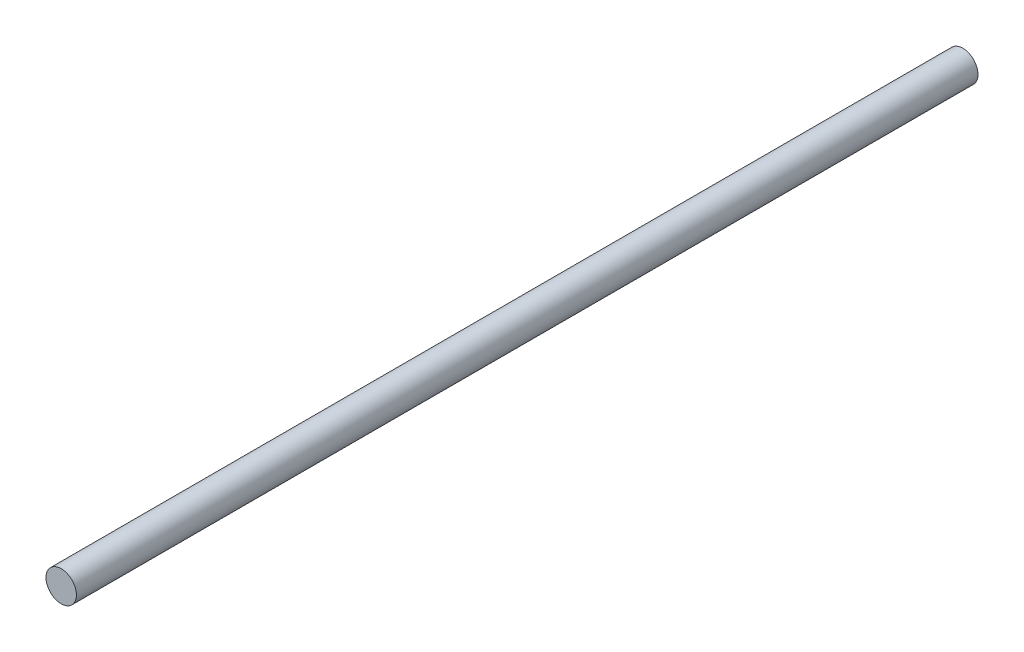
ISO-10303-21;
HEADER;
FILE_DESCRIPTION(('STEP AP214'),'2;1');
FILE_NAME('part.step','',(''),(''),'','','');
FILE_SCHEMA(('AUTOMOTIVE_DESIGN { 1 0 10303 214 1 1 1 1 }'));
ENDSEC;
DATA;
#1=APPLICATION_CONTEXT('core data for automotive mechanical design processes');
#2=APPLICATION_PROTOCOL_DEFINITION('international standard','automotive_design',2000,#1);
#3=PRODUCT_CONTEXT('',#1,'mechanical');
#4=PRODUCT('Part','Part','',(#3));
#5=PRODUCT_RELATED_PRODUCT_CATEGORY('part','',(#4));
#6=PRODUCT_DEFINITION_FORMATION('','',#4);
#7=PRODUCT_DEFINITION_CONTEXT('part definition',#1,'design');
#8=PRODUCT_DEFINITION('design','',#6,#7);
#9=PRODUCT_DEFINITION_SHAPE('','',#8);
#10=(LENGTH_UNIT() NAMED_UNIT(*) SI_UNIT(.MILLI.,.METRE.));
#11=(NAMED_UNIT(*) PLANE_ANGLE_UNIT() SI_UNIT($,.RADIAN.));
#12=(NAMED_UNIT(*) SI_UNIT($,.STERADIAN.) SOLID_ANGLE_UNIT());
#13=UNCERTAINTY_MEASURE_WITH_UNIT(LENGTH_MEASURE(1.E-05),#10,'distance_accuracy_value','');
#14=(GEOMETRIC_REPRESENTATION_CONTEXT(3) GLOBAL_UNCERTAINTY_ASSIGNED_CONTEXT((#13)) GLOBAL_UNIT_ASSIGNED_CONTEXT((#10,
#11,#12)) REPRESENTATION_CONTEXT('',''));
#15=CARTESIAN_POINT('',(0.,0.,0.));
#16=DIRECTION('',(0.,0.,1.));
#17=DIRECTION('',(1.,0.,0.));
#18=AXIS2_PLACEMENT_3D('',#15,#16,#17);
#19=CARTESIAN_POINT('',(0.,0.,237.));
#20=DIRECTION('',(0.,0.,-1.));
#21=DIRECTION('',(-1.,0.,0.));
#22=AXIS2_PLACEMENT_3D('',#19,#20,#21);
#23=CYLINDRICAL_SURFACE('',#22,4.);
#24=CARTESIAN_POINT('',(0.,0.,237.));
#25=DIRECTION('',(0.,0.,1.));
#26=DIRECTION('',(1.,0.,0.));
#27=AXIS2_PLACEMENT_3D('',#24,#25,#26);
#28=CIRCLE('',#27,4.);
#29=CARTESIAN_POINT('',(4.,0.,237.));
#30=VERTEX_POINT('',#29);
#31=EDGE_CURVE('E10',#30,#30,#28,.T.);
#32=ORIENTED_EDGE('',*,*,#31,.F.);
#33=EDGE_LOOP('',(#32));
#34=FACE_BOUND('',#33,.T.);
#35=CARTESIAN_POINT('',(0.,0.,0.));
#36=DIRECTION('',(0.,0.,1.));
#37=DIRECTION('',(1.,0.,0.));
#38=AXIS2_PLACEMENT_3D('',#35,#36,#37);
#39=CIRCLE('',#38,4.);
#40=CARTESIAN_POINT('',(4.,0.,0.));
#41=VERTEX_POINT('',#40);
#42=EDGE_CURVE('E34',#41,#41,#39,.T.);
#43=ORIENTED_EDGE('',*,*,#42,.T.);
#44=EDGE_LOOP('',(#43));
#45=FACE_BOUND('',#44,.T.);
#46=ADVANCED_FACE('F31',(#34,#45),#23,.T.);
#47=CARTESIAN_POINT('',(0.,0.,237.));
#48=DIRECTION('',(0.,0.,1.));
#49=DIRECTION('',(1.,0.,0.));
#50=AXIS2_PLACEMENT_3D('',#47,#48,#49);
#51=PLANE('',#50);
#52=ORIENTED_EDGE('',*,*,#31,.T.);
#53=EDGE_LOOP('',(#52));
#54=FACE_BOUND('',#53,.T.);
#55=ADVANCED_FACE('F46',(#54),#51,.T.);
#56=CARTESIAN_POINT('',(0.,0.,0.));
#57=DIRECTION('',(0.,0.,1.));
#58=DIRECTION('',(1.,0.,0.));
#59=AXIS2_PLACEMENT_3D('',#56,#57,#58);
#60=PLANE('',#59);
#61=ORIENTED_EDGE('',*,*,#42,.F.);
#62=EDGE_LOOP('',(#61));
#63=FACE_BOUND('',#62,.T.);
#64=ADVANCED_FACE('F44',(#63),#60,.F.);
#65=CLOSED_SHELL('',(#46,#55,#64));
#66=MANIFOLD_SOLID_BREP('B2',#65);
#67=ADVANCED_BREP_SHAPE_REPRESENTATION('',(#18,#66),#14);
#68=SHAPE_DEFINITION_REPRESENTATION(#9,#67);
ENDSEC;
END-ISO-10303-21;
